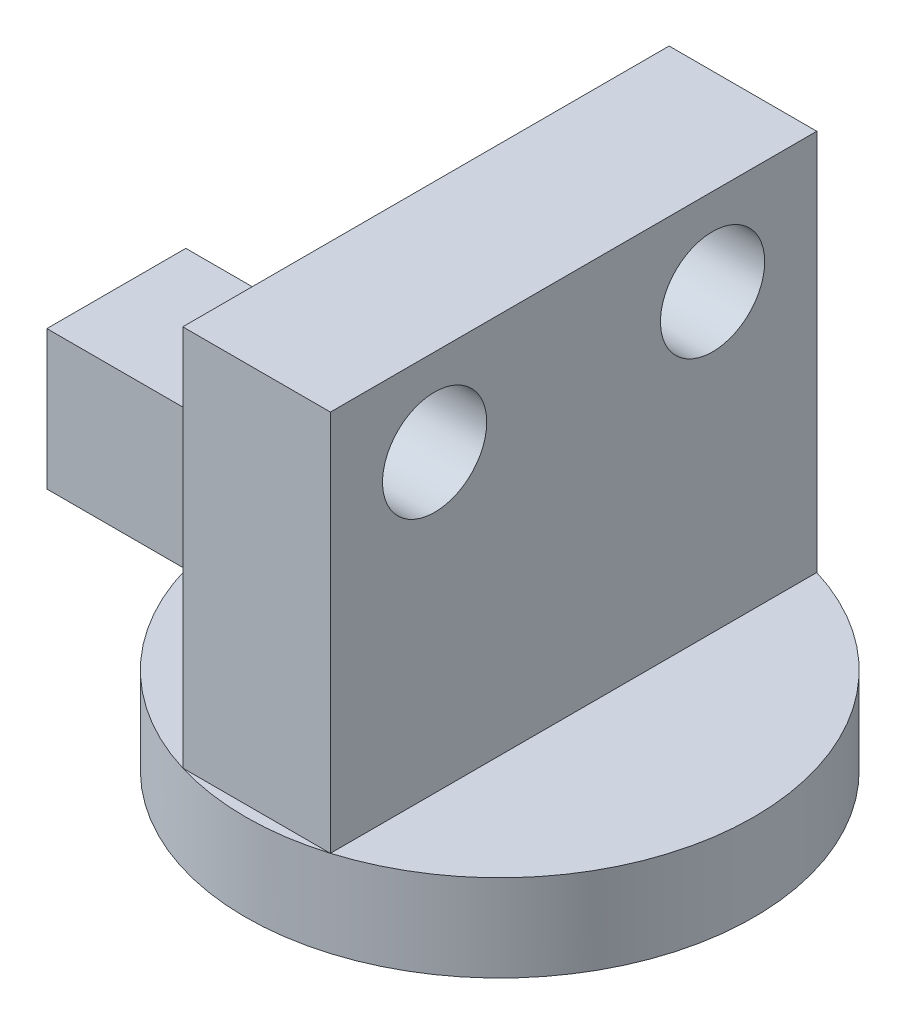
ISO-10303-21;
HEADER;
FILE_DESCRIPTION(('STEP AP214'),'2;1');
FILE_NAME('part.step','',(''),(''),'','','');
FILE_SCHEMA(('AUTOMOTIVE_DESIGN { 1 0 10303 214 1 1 1 1 }'));
ENDSEC;
DATA;
#1=APPLICATION_CONTEXT('core data for automotive mechanical design processes');
#2=APPLICATION_PROTOCOL_DEFINITION('international standard','automotive_design',2000,#1);
#3=PRODUCT_CONTEXT('',#1,'mechanical');
#4=PRODUCT('Part','Part','',(#3));
#5=PRODUCT_RELATED_PRODUCT_CATEGORY('part','',(#4));
#6=PRODUCT_DEFINITION_FORMATION('','',#4);
#7=PRODUCT_DEFINITION_CONTEXT('part definition',#1,'design');
#8=PRODUCT_DEFINITION('design','',#6,#7);
#9=PRODUCT_DEFINITION_SHAPE('','',#8);
#10=(LENGTH_UNIT() NAMED_UNIT(*) SI_UNIT(.MILLI.,.METRE.));
#11=(NAMED_UNIT(*) PLANE_ANGLE_UNIT() SI_UNIT($,.RADIAN.));
#12=(NAMED_UNIT(*) SI_UNIT($,.STERADIAN.) SOLID_ANGLE_UNIT());
#13=UNCERTAINTY_MEASURE_WITH_UNIT(LENGTH_MEASURE(1.E-05),#10,'distance_accuracy_value','');
#14=(GEOMETRIC_REPRESENTATION_CONTEXT(3) GLOBAL_UNCERTAINTY_ASSIGNED_CONTEXT((#13)) GLOBAL_UNIT_ASSIGNED_CONTEXT((#10,
#11,#12)) REPRESENTATION_CONTEXT('',''));
#15=CARTESIAN_POINT('',(0.,0.,0.));
#16=DIRECTION('',(0.,0.,1.));
#17=DIRECTION('',(1.,0.,0.));
#18=AXIS2_PLACEMENT_3D('',#15,#16,#17);
#19=CARTESIAN_POINT('',(0.,-171.45,0.));
#20=DIRECTION('',(0.,-1.,0.));
#21=DIRECTION('',(0.,0.,-1.));
#22=AXIS2_PLACEMENT_3D('',#19,#20,#21);
#23=PLANE('',#22);
#24=DIRECTION('',(1.,0.,0.));
#25=VECTOR('',#24,1.);
#26=CARTESIAN_POINT('',(-77.1330429019771,-171.45,50.8));
#27=LINE('',#26,#25);
#28=CARTESIAN_POINT('',(-178.733042901977,-171.45,50.8));
#29=VERTEX_POINT('',#28);
#30=CARTESIAN_POINT('',(-77.1330429019771,-171.45,50.8));
#31=VERTEX_POINT('',#30);
#32=EDGE_CURVE('E143',#29,#31,#27,.T.);
#33=ORIENTED_EDGE('',*,*,#32,.F.);
#34=CARTESIAN_POINT('',(0.,-171.45,0.));
#35=DIRECTION('',(0.,-1.,0.));
#36=DIRECTION('',(0.,0.,-1.));
#37=AXIS2_PLACEMENT_3D('',#34,#35,#36);
#38=CIRCLE('',#37,185.812111082674);
#39=CARTESIAN_POINT('',(-53.975,-171.45,177.8));
#40=VERTEX_POINT('',#39);
#41=EDGE_CURVE('E255',#40,#29,#38,.T.);
#42=ORIENTED_EDGE('',*,*,#41,.F.);
#43=DIRECTION('',(0.,0.,-1.));
#44=VECTOR('',#43,1.);
#45=CARTESIAN_POINT('',(-53.975,-171.45,177.8));
#46=LINE('',#45,#44);
#47=CARTESIAN_POINT('',(-53.975,-171.45,-177.8));
#48=VERTEX_POINT('',#47);
#49=EDGE_CURVE('E186',#40,#48,#46,.T.);
#50=ORIENTED_EDGE('',*,*,#49,.T.);
#51=CARTESIAN_POINT('',(-178.733042901977,-171.45,-50.8));
#52=VERTEX_POINT('',#51);
#53=EDGE_CURVE('E182',#52,#48,#38,.T.);
#54=ORIENTED_EDGE('',*,*,#53,.F.);
#55=DIRECTION('',(-1.,0.,0.));
#56=VECTOR('',#55,1.);
#57=CARTESIAN_POINT('',(-77.1330429019771,-171.45,-50.8));
#58=LINE('',#57,#56);
#59=CARTESIAN_POINT('',(-77.1330429019771,-171.45,-50.8));
#60=VERTEX_POINT('',#59);
#61=EDGE_CURVE('E66',#60,#52,#58,.T.);
#62=ORIENTED_EDGE('',*,*,#61,.F.);
#63=DIRECTION('',(0.,0.,-1.));
#64=VECTOR('',#63,1.);
#65=CARTESIAN_POINT('',(-77.1330429019771,-171.45,-50.8));
#66=LINE('',#65,#64);
#67=EDGE_CURVE('E61',#31,#60,#66,.T.);
#68=ORIENTED_EDGE('',*,*,#67,.F.);
#69=EDGE_LOOP('',(#33,#42,#50,#54,#62,#68));
#70=FACE_BOUND('',#69,.T.);
#71=ADVANCED_FACE('F45',(#70),#23,.F.);
#72=CARTESIAN_POINT('',(53.975,0.,0.));
#73=DIRECTION('',(1.,0.,0.));
#74=DIRECTION('',(0.,0.,-1.));
#75=AXIS2_PLACEMENT_3D('',#72,#73,#74);
#76=PLANE('',#75);
#77=CARTESIAN_POINT('',(53.975,44.45,101.6));
#78=DIRECTION('',(1.,0.,0.));
#79=DIRECTION('',(0.,0.,-1.));
#80=AXIS2_PLACEMENT_3D('',#77,#78,#79);
#81=CIRCLE('',#80,38.1);
#82=CARTESIAN_POINT('',(53.975,44.45,63.5));
#83=VERTEX_POINT('',#82);
#84=EDGE_CURVE('E207',#83,#83,#81,.T.);
#85=ORIENTED_EDGE('',*,*,#84,.F.);
#86=EDGE_LOOP('',(#85));
#87=FACE_BOUND('',#86,.T.);
#88=DIRECTION('',(0.,1.,0.));
#89=VECTOR('',#88,1.);
#90=CARTESIAN_POINT('',(53.975,107.95,-177.8));
#91=LINE('',#90,#89);
#92=CARTESIAN_POINT('',(53.975,-171.45,-177.8));
#93=VERTEX_POINT('',#92);
#94=CARTESIAN_POINT('',(53.975,107.95,-177.8));
#95=VERTEX_POINT('',#94);
#96=EDGE_CURVE('E215',#93,#95,#91,.T.);
#97=ORIENTED_EDGE('',*,*,#96,.T.);
#98=DIRECTION('',(0.,0.,1.));
#99=VECTOR('',#98,1.);
#100=CARTESIAN_POINT('',(53.975,107.95,177.8));
#101=LINE('',#100,#99);
#102=CARTESIAN_POINT('',(53.975,107.95,177.8));
#103=VERTEX_POINT('',#102);
#104=EDGE_CURVE('E219',#95,#103,#101,.T.);
#105=ORIENTED_EDGE('',*,*,#104,.T.);
#106=DIRECTION('',(0.,-1.,0.));
#107=VECTOR('',#106,1.);
#108=CARTESIAN_POINT('',(53.975,107.95,177.8));
#109=LINE('',#108,#107);
#110=CARTESIAN_POINT('',(53.9749999999999,-171.45,177.8));
#111=VERTEX_POINT('',#110);
#112=EDGE_CURVE('E223',#103,#111,#109,.T.);
#113=ORIENTED_EDGE('',*,*,#112,.T.);
#114=DIRECTION('',(0.,0.,1.));
#115=VECTOR('',#114,1.);
#116=CARTESIAN_POINT('',(53.975,-171.45,-177.8));
#117=LINE('',#116,#115);
#118=EDGE_CURVE('E194',#93,#111,#117,.T.);
#119=ORIENTED_EDGE('',*,*,#118,.F.);
#120=EDGE_LOOP('',(#97,#105,#113,#119));
#121=FACE_BOUND('',#120,.T.);
#122=CARTESIAN_POINT('',(53.975,44.45,-101.6));
#123=DIRECTION('',(1.,0.,0.));
#124=DIRECTION('',(0.,0.,-1.));
#125=AXIS2_PLACEMENT_3D('',#122,#123,#124);
#126=CIRCLE('',#125,38.1);
#127=CARTESIAN_POINT('',(53.975,44.45,-139.7));
#128=VERTEX_POINT('',#127);
#129=EDGE_CURVE('E199',#128,#128,#126,.T.);
#130=ORIENTED_EDGE('',*,*,#129,.F.);
#131=EDGE_LOOP('',(#130));
#132=FACE_BOUND('',#131,.T.);
#133=ADVANCED_FACE('F271',(#87,#121,#132),#76,.T.);
#134=CARTESIAN_POINT('',(-53.975,0.,0.));
#135=DIRECTION('',(1.,0.,0.));
#136=DIRECTION('',(0.,0.,-1.));
#137=AXIS2_PLACEMENT_3D('',#134,#135,#136);
#138=PLANE('',#137);
#139=DIRECTION('',(0.,1.,0.));
#140=VECTOR('',#139,1.);
#141=CARTESIAN_POINT('',(-53.975,107.95,-177.8));
#142=LINE('',#141,#140);
#143=CARTESIAN_POINT('',(-53.975,107.95,-177.8));
#144=VERTEX_POINT('',#143);
#145=EDGE_CURVE('E211',#48,#144,#142,.T.);
#146=ORIENTED_EDGE('',*,*,#145,.F.);
#147=ORIENTED_EDGE('',*,*,#49,.F.);
#148=DIRECTION('',(0.,-1.,0.));
#149=VECTOR('',#148,1.);
#150=CARTESIAN_POINT('',(-53.975,107.95,177.8));
#151=LINE('',#150,#149);
#152=CARTESIAN_POINT('',(-53.975,107.95,177.8));
#153=VERTEX_POINT('',#152);
#154=EDGE_CURVE('E220',#153,#40,#151,.T.);
#155=ORIENTED_EDGE('',*,*,#154,.F.);
#156=DIRECTION('',(0.,0.,1.));
#157=VECTOR('',#156,1.);
#158=CARTESIAN_POINT('',(-53.975,107.95,177.8));
#159=LINE('',#158,#157);
#160=EDGE_CURVE('E230',#144,#153,#159,.T.);
#161=ORIENTED_EDGE('',*,*,#160,.F.);
#162=EDGE_LOOP('',(#146,#147,#155,#161));
#163=FACE_BOUND('',#162,.T.);
#164=CARTESIAN_POINT('',(-53.975,44.45,101.6));
#165=DIRECTION('',(1.,0.,0.));
#166=DIRECTION('',(0.,0.,-1.));
#167=AXIS2_PLACEMENT_3D('',#164,#165,#166);
#168=CIRCLE('',#167,38.1);
#169=CARTESIAN_POINT('',(-53.975,44.45,63.5));
#170=VERTEX_POINT('',#169);
#171=EDGE_CURVE('E203',#170,#170,#168,.T.);
#172=ORIENTED_EDGE('',*,*,#171,.T.);
#173=EDGE_LOOP('',(#172));
#174=FACE_BOUND('',#173,.T.);
#175=CARTESIAN_POINT('',(-53.975,44.45,-101.6));
#176=DIRECTION('',(1.,0.,0.));
#177=DIRECTION('',(0.,0.,-1.));
#178=AXIS2_PLACEMENT_3D('',#175,#176,#177);
#179=CIRCLE('',#178,38.1);
#180=CARTESIAN_POINT('',(-53.975,44.45,-139.7));
#181=VERTEX_POINT('',#180);
#182=EDGE_CURVE('E198',#181,#181,#179,.T.);
#183=ORIENTED_EDGE('',*,*,#182,.T.);
#184=EDGE_LOOP('',(#183));
#185=FACE_BOUND('',#184,.T.);
#186=ADVANCED_FACE('F245',(#163,#174,#185),#138,.F.);
#187=CARTESIAN_POINT('',(53.975,107.95,-177.8));
#188=DIRECTION('',(0.,0.,1.));
#189=DIRECTION('',(1.,0.,0.));
#190=AXIS2_PLACEMENT_3D('',#187,#188,#189);
#191=PLANE('',#190);
#192=ORIENTED_EDGE('',*,*,#145,.T.);
#193=DIRECTION('',(-1.,0.,0.));
#194=VECTOR('',#193,1.);
#195=CARTESIAN_POINT('',(53.975,107.95,-177.8));
#196=LINE('',#195,#194);
#197=EDGE_CURVE('E11',#95,#144,#196,.T.);
#198=ORIENTED_EDGE('',*,*,#197,.F.);
#199=ORIENTED_EDGE('',*,*,#96,.F.);
#200=DIRECTION('',(1.,0.,0.));
#201=VECTOR('',#200,1.);
#202=CARTESIAN_POINT('',(-53.975,-171.45,-177.8));
#203=LINE('',#202,#201);
#204=EDGE_CURVE('E190',#48,#93,#203,.T.);
#205=ORIENTED_EDGE('',*,*,#204,.F.);
#206=EDGE_LOOP('',(#192,#198,#199,#205));
#207=FACE_BOUND('',#206,.T.);
#208=ADVANCED_FACE('F47',(#207),#191,.F.);
#209=CARTESIAN_POINT('',(53.975,107.95,177.8));
#210=DIRECTION('',(0.,-1.,0.));
#211=DIRECTION('',(0.,0.,-1.));
#212=AXIS2_PLACEMENT_3D('',#209,#210,#211);
#213=PLANE('',#212);
#214=ORIENTED_EDGE('',*,*,#160,.T.);
#215=DIRECTION('',(-1.,0.,0.));
#216=VECTOR('',#215,1.);
#217=CARTESIAN_POINT('',(53.975,107.95,177.8));
#218=LINE('',#217,#216);
#219=EDGE_CURVE('E54',#103,#153,#218,.T.);
#220=ORIENTED_EDGE('',*,*,#219,.F.);
#221=ORIENTED_EDGE('',*,*,#104,.F.);
#222=ORIENTED_EDGE('',*,*,#197,.T.);
#223=EDGE_LOOP('',(#214,#220,#221,#222));
#224=FACE_BOUND('',#223,.T.);
#225=ADVANCED_FACE('F276',(#224),#213,.F.);
#226=CARTESIAN_POINT('',(53.975,107.95,177.8));
#227=DIRECTION('',(0.,0.,-1.));
#228=DIRECTION('',(-1.,0.,0.));
#229=AXIS2_PLACEMENT_3D('',#226,#227,#228);
#230=PLANE('',#229);
#231=ORIENTED_EDGE('',*,*,#154,.T.);
#232=DIRECTION('',(-1.,0.,0.));
#233=VECTOR('',#232,1.);
#234=CARTESIAN_POINT('',(53.975,-171.45,177.8));
#235=LINE('',#234,#233);
#236=EDGE_CURVE('E176',#111,#40,#235,.T.);
#237=ORIENTED_EDGE('',*,*,#236,.F.);
#238=ORIENTED_EDGE('',*,*,#112,.F.);
#239=ORIENTED_EDGE('',*,*,#219,.T.);
#240=EDGE_LOOP('',(#231,#237,#238,#239));
#241=FACE_BOUND('',#240,.T.);
#242=ADVANCED_FACE('F240',(#241),#230,.F.);
#243=CARTESIAN_POINT('',(53.975,44.45,101.6));
#244=DIRECTION('',(-1.,0.,0.));
#245=DIRECTION('',(0.,0.,1.));
#246=AXIS2_PLACEMENT_3D('',#243,#244,#245);
#247=CYLINDRICAL_SURFACE('',#246,38.1);
#248=ORIENTED_EDGE('',*,*,#84,.T.);
#249=EDGE_LOOP('',(#248));
#250=FACE_BOUND('',#249,.T.);
#251=ORIENTED_EDGE('',*,*,#171,.F.);
#252=EDGE_LOOP('',(#251));
#253=FACE_BOUND('',#252,.T.);
#254=ADVANCED_FACE('F282',(#250,#253),#247,.F.);
#255=CARTESIAN_POINT('',(53.975,44.45,-101.6));
#256=DIRECTION('',(-1.,0.,0.));
#257=DIRECTION('',(0.,0.,1.));
#258=AXIS2_PLACEMENT_3D('',#255,#256,#257);
#259=CYLINDRICAL_SURFACE('',#258,38.1);
#260=ORIENTED_EDGE('',*,*,#129,.T.);
#261=EDGE_LOOP('',(#260));
#262=FACE_BOUND('',#261,.T.);
#263=ORIENTED_EDGE('',*,*,#182,.F.);
#264=EDGE_LOOP('',(#263));
#265=FACE_BOUND('',#264,.T.);
#266=ADVANCED_FACE('F294',(#262,#265),#259,.F.);
#267=EDGE_CURVE('E181',#111,#40,#38,.T.);
#268=ORIENTED_EDGE('',*,*,#267,.F.);
#269=ORIENTED_EDGE('',*,*,#236,.T.);
#270=EDGE_LOOP('',(#268,#269));
#271=FACE_BOUND('',#270,.T.);
#272=ADVANCED_FACE('F252',(#271),#23,.F.);
#273=EDGE_CURVE('E171',#48,#93,#38,.T.);
#274=ORIENTED_EDGE('',*,*,#273,.F.);
#275=ORIENTED_EDGE('',*,*,#204,.T.);
#276=EDGE_LOOP('',(#274,#275));
#277=FACE_BOUND('',#276,.T.);
#278=ADVANCED_FACE('F274',(#277),#23,.F.);
#279=CARTESIAN_POINT('',(0.,-234.95,0.));
#280=DIRECTION('',(0.,1.,0.));
#281=DIRECTION('',(0.,0.,1.));
#282=AXIS2_PLACEMENT_3D('',#279,#280,#281);
#283=CYLINDRICAL_SURFACE('',#282,185.812111082674);
#284=CARTESIAN_POINT('',(0.,-234.95,0.));
#285=DIRECTION('',(0.,-1.,0.));
#286=DIRECTION('',(0.,0.,-1.));
#287=AXIS2_PLACEMENT_3D('',#284,#285,#286);
#288=CIRCLE('',#287,185.812111082674);
#289=CARTESIAN_POINT('',(0.,-234.95,-185.812111082674));
#290=VERTEX_POINT('',#289);
#291=EDGE_CURVE('E172',#290,#290,#288,.T.);
#292=ORIENTED_EDGE('',*,*,#291,.F.);
#293=EDGE_LOOP('',(#292));
#294=FACE_BOUND('',#293,.T.);
#295=EDGE_CURVE('E177',#93,#111,#38,.T.);
#296=ORIENTED_EDGE('',*,*,#295,.T.);
#297=ORIENTED_EDGE('',*,*,#267,.T.);
#298=ORIENTED_EDGE('',*,*,#41,.T.);
#299=EDGE_CURVE('E258',#29,#52,#38,.T.);
#300=ORIENTED_EDGE('',*,*,#299,.T.);
#301=ORIENTED_EDGE('',*,*,#53,.T.);
#302=ORIENTED_EDGE('',*,*,#273,.T.);
#303=EDGE_LOOP('',(#296,#297,#298,#300,#301,#302));
#304=FACE_BOUND('',#303,.T.);
#305=ADVANCED_FACE('F259',(#294,#304),#283,.T.);
#306=CARTESIAN_POINT('',(0.,-234.95,0.));
#307=DIRECTION('',(0.,-1.,0.));
#308=DIRECTION('',(0.,0.,-1.));
#309=AXIS2_PLACEMENT_3D('',#306,#307,#308);
#310=PLANE('',#309);
#311=ORIENTED_EDGE('',*,*,#291,.T.);
#312=EDGE_LOOP('',(#311));
#313=FACE_BOUND('',#312,.T.);
#314=ADVANCED_FACE('F297',(#313),#310,.T.);
#315=ORIENTED_EDGE('',*,*,#295,.F.);
#316=ORIENTED_EDGE('',*,*,#118,.T.);
#317=EDGE_LOOP('',(#315,#316));
#318=FACE_BOUND('',#317,.T.);
#319=ADVANCED_FACE('F268',(#318),#23,.F.);
#320=CARTESIAN_POINT('',(-77.1330429019771,-69.85,50.8));
#321=DIRECTION('',(0.,0.,-1.));
#322=DIRECTION('',(-1.,0.,0.));
#323=AXIS2_PLACEMENT_3D('',#320,#321,#322);
#324=PLANE('',#323);
#325=ORIENTED_EDGE('',*,*,#32,.T.);
#326=DIRECTION('',(0.,-1.,0.));
#327=VECTOR('',#326,1.);
#328=CARTESIAN_POINT('',(-77.1330429019771,-69.85,50.8));
#329=LINE('',#328,#327);
#330=CARTESIAN_POINT('',(-77.1330429019771,-69.85,50.8));
#331=VERTEX_POINT('',#330);
#332=EDGE_CURVE('E167',#331,#31,#329,.T.);
#333=ORIENTED_EDGE('',*,*,#332,.F.);
#334=DIRECTION('',(1.,0.,0.));
#335=VECTOR('',#334,1.);
#336=CARTESIAN_POINT('',(-77.1330429019771,-69.85,50.8));
#337=LINE('',#336,#335);
#338=CARTESIAN_POINT('',(-280.333042901977,-69.85,50.8));
#339=VERTEX_POINT('',#338);
#340=EDGE_CURVE('E151',#339,#331,#337,.T.);
#341=ORIENTED_EDGE('',*,*,#340,.F.);
#342=DIRECTION('',(0.,1.,0.));
#343=VECTOR('',#342,1.);
#344=CARTESIAN_POINT('',(-280.333042901977,-171.45,50.8));
#345=LINE('',#344,#343);
#346=CARTESIAN_POINT('',(-280.333042901977,-171.45,50.8));
#347=VERTEX_POINT('',#346);
#348=EDGE_CURVE('E128',#347,#339,#345,.T.);
#349=ORIENTED_EDGE('',*,*,#348,.F.);
#350=DIRECTION('',(1.,0.,0.));
#351=VECTOR('',#350,1.);
#352=CARTESIAN_POINT('',(-280.333042901977,-171.45,50.8));
#353=LINE('',#352,#351);
#354=EDGE_CURVE('E123',#347,#29,#353,.T.);
#355=ORIENTED_EDGE('',*,*,#354,.T.);
#356=EDGE_LOOP('',(#325,#333,#341,#349,#355));
#357=FACE_BOUND('',#356,.T.);
#358=ADVANCED_FACE('F296',(#357),#324,.F.);
#359=CARTESIAN_POINT('',(-77.1330429019771,-69.85,-50.8));
#360=DIRECTION('',(-1.,0.,0.));
#361=DIRECTION('',(0.,0.,1.));
#362=AXIS2_PLACEMENT_3D('',#359,#360,#361);
#363=PLANE('',#362);
#364=ORIENTED_EDGE('',*,*,#67,.T.);
#365=DIRECTION('',(0.,-1.,0.));
#366=VECTOR('',#365,1.);
#367=CARTESIAN_POINT('',(-77.1330429019771,-69.85,-50.8));
#368=LINE('',#367,#366);
#369=CARTESIAN_POINT('',(-77.1330429019771,-69.85,-50.8));
#370=VERTEX_POINT('',#369);
#371=EDGE_CURVE('E159',#370,#60,#368,.T.);
#372=ORIENTED_EDGE('',*,*,#371,.F.);
#373=DIRECTION('',(0.,0.,-1.));
#374=VECTOR('',#373,1.);
#375=CARTESIAN_POINT('',(-77.1330429019771,-69.85,-50.8));
#376=LINE('',#375,#374);
#377=EDGE_CURVE('E154',#331,#370,#376,.T.);
#378=ORIENTED_EDGE('',*,*,#377,.F.);
#379=ORIENTED_EDGE('',*,*,#332,.T.);
#380=EDGE_LOOP('',(#364,#372,#378,#379));
#381=FACE_BOUND('',#380,.T.);
#382=ADVANCED_FACE('F302',(#381),#363,.F.);
#383=CARTESIAN_POINT('',(-77.1330429019771,-69.85,-50.8));
#384=DIRECTION('',(0.,0.,1.));
#385=DIRECTION('',(1.,0.,0.));
#386=AXIS2_PLACEMENT_3D('',#383,#384,#385);
#387=PLANE('',#386);
#388=ORIENTED_EDGE('',*,*,#61,.T.);
#389=DIRECTION('',(1.,0.,0.));
#390=VECTOR('',#389,1.);
#391=CARTESIAN_POINT('',(-280.333042901977,-171.45,-50.8));
#392=LINE('',#391,#390);
#393=CARTESIAN_POINT('',(-280.333042901977,-171.45,-50.8));
#394=VERTEX_POINT('',#393);
#395=EDGE_CURVE('E120',#394,#52,#392,.T.);
#396=ORIENTED_EDGE('',*,*,#395,.F.);
#397=DIRECTION('',(0.,-1.,0.));
#398=VECTOR('',#397,1.);
#399=CARTESIAN_POINT('',(-280.333042901977,-69.85,-50.8));
#400=LINE('',#399,#398);
#401=CARTESIAN_POINT('',(-280.333042901977,-69.85,-50.8));
#402=VERTEX_POINT('',#401);
#403=EDGE_CURVE('E129',#402,#394,#400,.T.);
#404=ORIENTED_EDGE('',*,*,#403,.F.);
#405=DIRECTION('',(-1.,0.,0.));
#406=VECTOR('',#405,1.);
#407=CARTESIAN_POINT('',(-77.1330429019771,-69.85,-50.8));
#408=LINE('',#407,#406);
#409=EDGE_CURVE('E157',#370,#402,#408,.T.);
#410=ORIENTED_EDGE('',*,*,#409,.F.);
#411=ORIENTED_EDGE('',*,*,#371,.T.);
#412=EDGE_LOOP('',(#388,#396,#404,#410,#411));
#413=FACE_BOUND('',#412,.T.);
#414=ADVANCED_FACE('F140',(#413),#387,.F.);
#415=CARTESIAN_POINT('',(0.,-69.85,0.));
#416=DIRECTION('',(0.,-1.,0.));
#417=DIRECTION('',(0.,0.,-1.));
#418=AXIS2_PLACEMENT_3D('',#415,#416,#417);
#419=PLANE('',#418);
#420=ORIENTED_EDGE('',*,*,#409,.T.);
#421=DIRECTION('',(0.,0.,-1.));
#422=VECTOR('',#421,1.);
#423=CARTESIAN_POINT('',(-280.333042901977,-69.85,50.8));
#424=LINE('',#423,#422);
#425=EDGE_CURVE('E135',#339,#402,#424,.T.);
#426=ORIENTED_EDGE('',*,*,#425,.F.);
#427=ORIENTED_EDGE('',*,*,#340,.T.);
#428=ORIENTED_EDGE('',*,*,#377,.T.);
#429=EDGE_LOOP('',(#420,#426,#427,#428));
#430=FACE_BOUND('',#429,.T.);
#431=ADVANCED_FACE('F406',(#430),#419,.F.);
#432=CARTESIAN_POINT('',(-280.333042901977,-171.45,-50.8));
#433=DIRECTION('',(0.,1.,0.));
#434=DIRECTION('',(0.,0.,1.));
#435=AXIS2_PLACEMENT_3D('',#432,#433,#434);
#436=PLANE('',#435);
#437=ORIENTED_EDGE('',*,*,#395,.T.);
#438=ORIENTED_EDGE('',*,*,#299,.F.);
#439=ORIENTED_EDGE('',*,*,#354,.F.);
#440=DIRECTION('',(0.,0.,1.));
#441=VECTOR('',#440,1.);
#442=CARTESIAN_POINT('',(-280.333042901977,-171.45,-50.8));
#443=LINE('',#442,#441);
#444=EDGE_CURVE('E116',#394,#347,#443,.T.);
#445=ORIENTED_EDGE('',*,*,#444,.F.);
#446=EDGE_LOOP('',(#437,#438,#439,#445));
#447=FACE_BOUND('',#446,.T.);
#448=ADVANCED_FACE('F118',(#447),#436,.F.);
#449=CARTESIAN_POINT('',(-280.333042901977,0.,0.));
#450=DIRECTION('',(-1.,0.,0.));
#451=DIRECTION('',(0.,0.,1.));
#452=AXIS2_PLACEMENT_3D('',#449,#450,#451);
#453=PLANE('',#452);
#454=ORIENTED_EDGE('',*,*,#403,.T.);
#455=ORIENTED_EDGE('',*,*,#444,.T.);
#456=ORIENTED_EDGE('',*,*,#348,.T.);
#457=ORIENTED_EDGE('',*,*,#425,.T.);
#458=EDGE_LOOP('',(#454,#455,#456,#457));
#459=FACE_BOUND('',#458,.T.);
#460=ADVANCED_FACE('F133',(#459),#453,.T.);
#461=CLOSED_SHELL('',(#71,#133,#186,#208,#225,#242,#254,#266,#272,#278,#305,#314,#319,#358,#382,
#414,#431,#448,#460));
#462=MANIFOLD_SOLID_BREP('B2',#461);
#463=ADVANCED_BREP_SHAPE_REPRESENTATION('',(#18,#462),#14);
#464=SHAPE_DEFINITION_REPRESENTATION(#9,#463);
ENDSEC;
END-ISO-10303-21;
